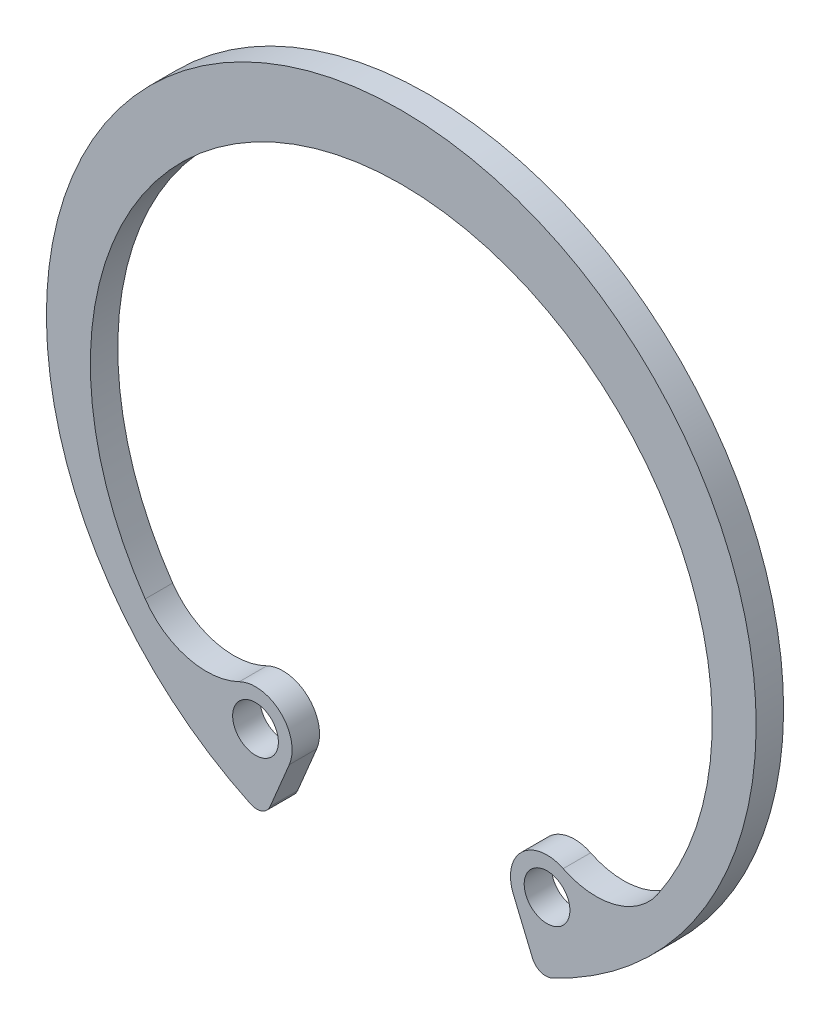
ISO-10303-21;
HEADER;
FILE_DESCRIPTION(('STEP AP214'),'2;1');
FILE_NAME('part.step','',(''),(''),'','','');
FILE_SCHEMA(('AUTOMOTIVE_DESIGN { 1 0 10303 214 1 1 1 1 }'));
ENDSEC;
DATA;
#1=APPLICATION_CONTEXT('core data for automotive mechanical design processes');
#2=APPLICATION_PROTOCOL_DEFINITION('international standard','automotive_design',2000,#1);
#3=PRODUCT_CONTEXT('',#1,'mechanical');
#4=PRODUCT('Part','Part','',(#3));
#5=PRODUCT_RELATED_PRODUCT_CATEGORY('part','',(#4));
#6=PRODUCT_DEFINITION_FORMATION('','',#4);
#7=PRODUCT_DEFINITION_CONTEXT('part definition',#1,'design');
#8=PRODUCT_DEFINITION('design','',#6,#7);
#9=PRODUCT_DEFINITION_SHAPE('','',#8);
#10=(LENGTH_UNIT() NAMED_UNIT(*) SI_UNIT(.MILLI.,.METRE.));
#11=(NAMED_UNIT(*) PLANE_ANGLE_UNIT() SI_UNIT($,.RADIAN.));
#12=(NAMED_UNIT(*) SI_UNIT($,.STERADIAN.) SOLID_ANGLE_UNIT());
#13=UNCERTAINTY_MEASURE_WITH_UNIT(LENGTH_MEASURE(1.E-05),#10,'distance_accuracy_value','');
#14=(GEOMETRIC_REPRESENTATION_CONTEXT(3) GLOBAL_UNCERTAINTY_ASSIGNED_CONTEXT((#13)) GLOBAL_UNIT_ASSIGNED_CONTEXT((#10,
#11,#12)) REPRESENTATION_CONTEXT('',''));
#15=CARTESIAN_POINT('',(0.,0.,0.));
#16=DIRECTION('',(0.,0.,1.));
#17=DIRECTION('',(1.,0.,0.));
#18=AXIS2_PLACEMENT_3D('',#15,#16,#17);
#19=CARTESIAN_POINT('',(0.,0.,-0.749999999999999));
#20=DIRECTION('',(0.,0.,1.));
#21=DIRECTION('',(1.,0.,0.));
#22=AXIS2_PLACEMENT_3D('',#19,#20,#21);
#23=CYLINDRICAL_SURFACE('',#22,19.4);
#24=CARTESIAN_POINT('',(0.,0.,0.750000000000001));
#25=DIRECTION('',(0.,0.,1.));
#26=DIRECTION('',(-1.,0.,0.));
#27=AXIS2_PLACEMENT_3D('',#24,#25,#26);
#28=CIRCLE('',#27,19.4);
#29=CARTESIAN_POINT('',(8.23961465419929,-17.5632784624712,0.750000000000001));
#30=VERTEX_POINT('',#29);
#31=CARTESIAN_POINT('',(-8.23961465419929,-17.5632784624712,0.750000000000001));
#32=VERTEX_POINT('',#31);
#33=EDGE_CURVE('E131',#30,#32,#28,.T.);
#34=ORIENTED_EDGE('',*,*,#33,.F.);
#35=DIRECTION('',(0.,0.,1.));
#36=VECTOR('',#35,1.);
#37=CARTESIAN_POINT('',(8.2396146541993,-17.5632784624712,-0.749999999999999));
#38=LINE('',#37,#36);
#39=CARTESIAN_POINT('',(8.23961465419929,-17.5632784624712,-0.749999999999999));
#40=VERTEX_POINT('',#39);
#41=EDGE_CURVE('E230',#30,#40,#38,.F.);
#42=ORIENTED_EDGE('',*,*,#41,.T.);
#43=CARTESIAN_POINT('',(0.,0.,-0.749999999999999));
#44=DIRECTION('',(0.,0.,1.));
#45=DIRECTION('',(-1.,0.,0.));
#46=AXIS2_PLACEMENT_3D('',#43,#44,#45);
#47=CIRCLE('',#46,19.4);
#48=CARTESIAN_POINT('',(-8.23961465419929,-17.5632784624712,-0.749999999999999));
#49=VERTEX_POINT('',#48);
#50=EDGE_CURVE('E176',#40,#49,#47,.T.);
#51=ORIENTED_EDGE('',*,*,#50,.T.);
#52=DIRECTION('',(0.,0.,1.));
#53=VECTOR('',#52,1.);
#54=CARTESIAN_POINT('',(-8.23961465419929,-17.5632784624712,-0.749999999999999));
#55=LINE('',#54,#53);
#56=EDGE_CURVE('E226',#49,#32,#55,.T.);
#57=ORIENTED_EDGE('',*,*,#56,.T.);
#58=EDGE_LOOP('',(#34,#42,#51,#57));
#59=FACE_BOUND('',#58,.T.);
#60=ADVANCED_FACE('F42',(#59),#23,.T.);
#61=CARTESIAN_POINT('',(6.12302446274948,-14.6461111367001,-0.749999999999999));
#62=DIRECTION('',(-0.922618279569573,-0.385714285714286,0.));
#63=DIRECTION('',(0.385714285714286,-0.922618279569573,0.));
#64=AXIS2_PLACEMENT_3D('',#61,#62,#63);
#65=PLANE('',#64);
#66=DIRECTION('',(0.385714285714286,-0.922618279569573,0.));
#67=VECTOR('',#66,1.);
#68=CARTESIAN_POINT('',(6.12302446274948,-14.6461111367001,-0.749999999999999));
#69=LINE('',#68,#67);
#70=CARTESIAN_POINT('',(6.12302446274948,-14.6461111367001,-0.749999999999999));
#71=VERTEX_POINT('',#70);
#72=CARTESIAN_POINT('',(7.17016298593679,-17.1508385437885,-0.749999999999999));
#73=VERTEX_POINT('',#72);
#74=EDGE_CURVE('E142',#71,#73,#69,.T.);
#75=ORIENTED_EDGE('',*,*,#74,.T.);
#76=DIRECTION('',(0.,0.,1.));
#77=VECTOR('',#76,1.);
#78=CARTESIAN_POINT('',(7.17016298593679,-17.1508385437885,-0.749999999999999));
#79=LINE('',#78,#77);
#80=CARTESIAN_POINT('',(7.17016298593679,-17.1508385437885,0.750000000000001));
#81=VERTEX_POINT('',#80);
#82=EDGE_CURVE('E206',#73,#81,#79,.T.);
#83=ORIENTED_EDGE('',*,*,#82,.T.);
#84=DIRECTION('',(0.385714285714286,-0.922618279569573,0.));
#85=VECTOR('',#84,1.);
#86=CARTESIAN_POINT('',(6.12302446274948,-14.6461111367001,0.750000000000001));
#87=LINE('',#86,#85);
#88=CARTESIAN_POINT('',(6.12302446274948,-14.6461111367001,0.750000000000001));
#89=VERTEX_POINT('',#88);
#90=EDGE_CURVE('E165',#89,#81,#87,.T.);
#91=ORIENTED_EDGE('',*,*,#90,.F.);
#92=DIRECTION('',(0.,0.,1.));
#93=VECTOR('',#92,1.);
#94=CARTESIAN_POINT('',(6.12302446274948,-14.6461111367001,-0.749999999999999));
#95=LINE('',#94,#93);
#96=EDGE_CURVE('E203',#71,#89,#95,.T.);
#97=ORIENTED_EDGE('',*,*,#96,.F.);
#98=EDGE_LOOP('',(#75,#83,#91,#97));
#99=FACE_BOUND('',#98,.T.);
#100=ADVANCED_FACE('F244',(#99),#65,.T.);
#101=CARTESIAN_POINT('',(7.96826102188862,-13.8746825652716,-0.749999999999999));
#102=DIRECTION('',(0.,0.,1.));
#103=DIRECTION('',(1.,0.,0.));
#104=AXIS2_PLACEMENT_3D('',#101,#102,#103);
#105=CYLINDRICAL_SURFACE('',#104,2.);
#106=ORIENTED_EDGE('',*,*,#96,.T.);
#107=CARTESIAN_POINT('',(7.96826102188862,-13.8746825652716,0.750000000000001));
#108=DIRECTION('',(0.,0.,1.));
#109=DIRECTION('',(1.,0.,0.));
#110=AXIS2_PLACEMENT_3D('',#107,#108,#109);
#111=CIRCLE('',#110,2.);
#112=CARTESIAN_POINT('',(8.85144237587703,-12.0802493132482,0.750000000000001));
#113=VERTEX_POINT('',#112);
#114=EDGE_CURVE('E161',#113,#89,#111,.T.);
#115=ORIENTED_EDGE('',*,*,#114,.F.);
#116=DIRECTION('',(0.,0.,1.));
#117=VECTOR('',#116,1.);
#118=CARTESIAN_POINT('',(8.85144237587703,-12.0802493132482,-0.749999999999999));
#119=LINE('',#118,#117);
#120=CARTESIAN_POINT('',(8.85144237587703,-12.0802493132482,-0.749999999999999));
#121=VERTEX_POINT('',#120);
#122=EDGE_CURVE('E207',#121,#113,#119,.T.);
#123=ORIENTED_EDGE('',*,*,#122,.F.);
#124=CARTESIAN_POINT('',(7.96826102188862,-13.8746825652716,-0.749999999999999));
#125=DIRECTION('',(0.,0.,1.));
#126=DIRECTION('',(1.,0.,0.));
#127=AXIS2_PLACEMENT_3D('',#124,#125,#126);
#128=CIRCLE('',#127,2.);
#129=EDGE_CURVE('E196',#121,#71,#128,.T.);
#130=ORIENTED_EDGE('',*,*,#129,.T.);
#131=EDGE_LOOP('',(#106,#115,#123,#130));
#132=FACE_BOUND('',#131,.T.);
#133=ADVANCED_FACE('F279',(#132),#105,.T.);
#134=CARTESIAN_POINT('',(10.6483110380649,-8.4294013165285,-0.749999999999999));
#135=DIRECTION('',(0.,0.,1.));
#136=DIRECTION('',(1.,0.,0.));
#137=AXIS2_PLACEMENT_3D('',#134,#135,#136);
#138=CYLINDRICAL_SURFACE('',#137,4.06908197070359);
#139=ORIENTED_EDGE('',*,*,#122,.T.);
#140=CARTESIAN_POINT('',(10.6483110380649,-8.4294013165285,0.750000000000001));
#141=DIRECTION('',(0.,0.,-1.));
#142=DIRECTION('',(-1.,0.,0.));
#143=AXIS2_PLACEMENT_3D('',#140,#141,#142);
#144=CIRCLE('',#143,4.06908197070359);
#145=CARTESIAN_POINT('',(13.9997580022659,-10.7370475915137,0.750000000000001));
#146=VERTEX_POINT('',#145);
#147=EDGE_CURVE('E157',#146,#113,#144,.T.);
#148=ORIENTED_EDGE('',*,*,#147,.F.);
#149=DIRECTION('',(0.,0.,1.));
#150=VECTOR('',#149,1.);
#151=CARTESIAN_POINT('',(13.9997580022659,-10.7370475915137,-0.749999999999999));
#152=LINE('',#151,#150);
#153=CARTESIAN_POINT('',(13.9997580022659,-10.7370475915137,-0.749999999999999));
#154=VERTEX_POINT('',#153);
#155=EDGE_CURVE('E210',#154,#146,#152,.T.);
#156=ORIENTED_EDGE('',*,*,#155,.F.);
#157=CARTESIAN_POINT('',(10.6483110380649,-8.4294013165285,-0.749999999999999));
#158=DIRECTION('',(0.,0.,-1.));
#159=DIRECTION('',(-1.,0.,0.));
#160=AXIS2_PLACEMENT_3D('',#157,#158,#159);
#161=CIRCLE('',#160,4.06908197070359);
#162=EDGE_CURVE('E192',#154,#121,#161,.T.);
#163=ORIENTED_EDGE('',*,*,#162,.T.);
#164=EDGE_LOOP('',(#139,#148,#156,#163));
#165=FACE_BOUND('',#164,.T.);
#166=ADVANCED_FACE('F293',(#165),#138,.F.);
#167=CARTESIAN_POINT('',(0.,-1.09748302441495,-0.749999999999999));
#168=DIRECTION('',(0.,0.,1.));
#169=DIRECTION('',(1.,0.,0.));
#170=AXIS2_PLACEMENT_3D('',#167,#168,#169);
#171=CYLINDRICAL_SURFACE('',#170,16.9974830244149);
#172=ORIENTED_EDGE('',*,*,#155,.T.);
#173=CARTESIAN_POINT('',(0.,-1.09748302441495,0.750000000000001));
#174=DIRECTION('',(0.,0.,-1.));
#175=DIRECTION('',(-1.,0.,0.));
#176=AXIS2_PLACEMENT_3D('',#173,#174,#175);
#177=CIRCLE('',#176,16.9974830244149);
#178=CARTESIAN_POINT('',(-13.999758002266,-10.7370475915136,0.750000000000001));
#179=VERTEX_POINT('',#178);
#180=EDGE_CURVE('E150',#179,#146,#177,.T.);
#181=ORIENTED_EDGE('',*,*,#180,.F.);
#182=DIRECTION('',(0.,0.,1.));
#183=VECTOR('',#182,1.);
#184=CARTESIAN_POINT('',(-13.999758002266,-10.7370475915136,-0.749999999999999));
#185=LINE('',#184,#183);
#186=CARTESIAN_POINT('',(-13.999758002266,-10.7370475915136,-0.749999999999999));
#187=VERTEX_POINT('',#186);
#188=EDGE_CURVE('E213',#187,#179,#185,.T.);
#189=ORIENTED_EDGE('',*,*,#188,.F.);
#190=CARTESIAN_POINT('',(0.,-1.09748302441495,-0.749999999999999));
#191=DIRECTION('',(0.,0.,-1.));
#192=DIRECTION('',(-1.,0.,0.));
#193=AXIS2_PLACEMENT_3D('',#190,#191,#192);
#194=CIRCLE('',#193,16.9974830244149);
#195=EDGE_CURVE('E188',#187,#154,#194,.T.);
#196=ORIENTED_EDGE('',*,*,#195,.T.);
#197=EDGE_LOOP('',(#172,#181,#189,#196));
#198=FACE_BOUND('',#197,.T.);
#199=ADVANCED_FACE('F289',(#198),#171,.F.);
#200=CARTESIAN_POINT('',(-10.6483110380649,-8.4294013165285,-0.749999999999999));
#201=DIRECTION('',(0.,0.,1.));
#202=DIRECTION('',(1.,0.,0.));
#203=AXIS2_PLACEMENT_3D('',#200,#201,#202);
#204=CYLINDRICAL_SURFACE('',#203,4.06908197070359);
#205=ORIENTED_EDGE('',*,*,#188,.T.);
#206=CARTESIAN_POINT('',(-10.6483110380649,-8.4294013165285,0.750000000000001));
#207=DIRECTION('',(0.,0.,-1.));
#208=DIRECTION('',(1.,0.,0.));
#209=AXIS2_PLACEMENT_3D('',#206,#207,#208);
#210=CIRCLE('',#209,4.06908197070359);
#211=CARTESIAN_POINT('',(-8.85144237587703,-12.0802493132482,0.750000000000001));
#212=VERTEX_POINT('',#211);
#213=EDGE_CURVE('E146',#212,#179,#210,.T.);
#214=ORIENTED_EDGE('',*,*,#213,.F.);
#215=DIRECTION('',(0.,0.,1.));
#216=VECTOR('',#215,1.);
#217=CARTESIAN_POINT('',(-8.85144237587703,-12.0802493132482,-0.749999999999999));
#218=LINE('',#217,#216);
#219=CARTESIAN_POINT('',(-8.85144237587703,-12.0802493132482,-0.749999999999999));
#220=VERTEX_POINT('',#219);
#221=EDGE_CURVE('E141',#220,#212,#218,.T.);
#222=ORIENTED_EDGE('',*,*,#221,.F.);
#223=CARTESIAN_POINT('',(-10.6483110380649,-8.4294013165285,-0.749999999999999));
#224=DIRECTION('',(0.,0.,-1.));
#225=DIRECTION('',(1.,0.,0.));
#226=AXIS2_PLACEMENT_3D('',#223,#224,#225);
#227=CIRCLE('',#226,4.06908197070359);
#228=EDGE_CURVE('E184',#220,#187,#227,.T.);
#229=ORIENTED_EDGE('',*,*,#228,.T.);
#230=EDGE_LOOP('',(#205,#214,#222,#229));
#231=FACE_BOUND('',#230,.T.);
#232=ADVANCED_FACE('F286',(#231),#204,.F.);
#233=CARTESIAN_POINT('',(-7.96826102188862,-13.8746825652716,-0.749999999999999));
#234=DIRECTION('',(0.,0.,1.));
#235=DIRECTION('',(1.,0.,0.));
#236=AXIS2_PLACEMENT_3D('',#233,#234,#235);
#237=CYLINDRICAL_SURFACE('',#236,2.);
#238=ORIENTED_EDGE('',*,*,#221,.T.);
#239=CARTESIAN_POINT('',(-7.96826102188862,-13.8746825652716,0.750000000000001));
#240=DIRECTION('',(0.,0.,1.));
#241=DIRECTION('',(-1.,0.,0.));
#242=AXIS2_PLACEMENT_3D('',#239,#240,#241);
#243=CIRCLE('',#242,2.);
#244=CARTESIAN_POINT('',(-6.12302446274948,-14.6461111367001,0.750000000000001));
#245=VERTEX_POINT('',#244);
#246=EDGE_CURVE('E126',#245,#212,#243,.T.);
#247=ORIENTED_EDGE('',*,*,#246,.F.);
#248=DIRECTION('',(0.,0.,1.));
#249=VECTOR('',#248,1.);
#250=CARTESIAN_POINT('',(-6.12302446274948,-14.6461111367001,-0.749999999999999));
#251=LINE('',#250,#249);
#252=CARTESIAN_POINT('',(-6.12302446274948,-14.6461111367001,-0.749999999999999));
#253=VERTEX_POINT('',#252);
#254=EDGE_CURVE('E134',#253,#245,#251,.T.);
#255=ORIENTED_EDGE('',*,*,#254,.F.);
#256=CARTESIAN_POINT('',(-7.96826102188862,-13.8746825652716,-0.749999999999999));
#257=DIRECTION('',(0.,0.,1.));
#258=DIRECTION('',(-1.,0.,0.));
#259=AXIS2_PLACEMENT_3D('',#256,#257,#258);
#260=CIRCLE('',#259,2.);
#261=EDGE_CURVE('E181',#253,#220,#260,.T.);
#262=ORIENTED_EDGE('',*,*,#261,.T.);
#263=EDGE_LOOP('',(#238,#247,#255,#262));
#264=FACE_BOUND('',#263,.T.);
#265=ADVANCED_FACE('F144',(#264),#237,.T.);
#266=CARTESIAN_POINT('',(-6.12302446274948,-14.6461111367001,-0.749999999999999));
#267=DIRECTION('',(0.922618279569573,-0.385714285714286,0.));
#268=DIRECTION('',(0.385714285714286,0.922618279569573,0.));
#269=AXIS2_PLACEMENT_3D('',#266,#267,#268);
#270=PLANE('',#269);
#271=DIRECTION('',(0.385714285714286,0.922618279569573,0.));
#272=VECTOR('',#271,1.);
#273=CARTESIAN_POINT('',(-6.12302446274948,-14.6461111367001,0.750000000000001));
#274=LINE('',#273,#272);
#275=CARTESIAN_POINT('',(-7.17016298593679,-17.1508385437885,0.750000000000001));
#276=VERTEX_POINT('',#275);
#277=EDGE_CURVE('E119',#276,#245,#274,.T.);
#278=ORIENTED_EDGE('',*,*,#277,.F.);
#279=DIRECTION('',(0.,0.,1.));
#280=VECTOR('',#279,1.);
#281=CARTESIAN_POINT('',(-7.17016298593679,-17.1508385437885,-0.749999999999999));
#282=LINE('',#281,#280);
#283=CARTESIAN_POINT('',(-7.17016298593679,-17.1508385437885,-0.749999999999999));
#284=VERTEX_POINT('',#283);
#285=EDGE_CURVE('E11',#276,#284,#282,.F.);
#286=ORIENTED_EDGE('',*,*,#285,.T.);
#287=DIRECTION('',(0.385714285714286,0.922618279569573,0.));
#288=VECTOR('',#287,1.);
#289=CARTESIAN_POINT('',(-6.12302446274948,-14.6461111367001,-0.749999999999999));
#290=LINE('',#289,#288);
#291=EDGE_CURVE('E136',#284,#253,#290,.T.);
#292=ORIENTED_EDGE('',*,*,#291,.T.);
#293=ORIENTED_EDGE('',*,*,#254,.T.);
#294=EDGE_LOOP('',(#278,#286,#292,#293));
#295=FACE_BOUND('',#294,.T.);
#296=ADVANCED_FACE('F135',(#295),#270,.T.);
#297=CARTESIAN_POINT('',(0.,0.,-0.749999999999999));
#298=DIRECTION('',(0.,0.,-1.));
#299=DIRECTION('',(-1.,0.,0.));
#300=AXIS2_PLACEMENT_3D('',#297,#298,#299);
#301=PLANE('',#300);
#302=CARTESIAN_POINT('',(7.96826102188862,-13.8746825652716,-0.749999999999999));
#303=DIRECTION('',(0.,0.,1.));
#304=DIRECTION('',(-1.,0.,0.));
#305=AXIS2_PLACEMENT_3D('',#302,#303,#304);
#306=CIRCLE('',#305,1.25);
#307=CARTESIAN_POINT('',(6.71826102188862,-13.8746825652716,-0.749999999999999));
#308=VERTEX_POINT('',#307);
#309=EDGE_CURVE('E168',#308,#308,#306,.T.);
#310=ORIENTED_EDGE('',*,*,#309,.T.);
#311=EDGE_LOOP('',(#310));
#312=FACE_BOUND('',#311,.T.);
#313=CARTESIAN_POINT('',(-7.96826102188862,-13.8746825652716,-0.749999999999999));
#314=DIRECTION('',(0.,0.,1.));
#315=DIRECTION('',(1.,0.,0.));
#316=AXIS2_PLACEMENT_3D('',#313,#314,#315);
#317=CIRCLE('',#316,1.25);
#318=CARTESIAN_POINT('',(-6.71826102188862,-13.8746825652716,-0.749999999999999));
#319=VERTEX_POINT('',#318);
#320=EDGE_CURVE('E172',#319,#319,#317,.T.);
#321=ORIENTED_EDGE('',*,*,#320,.T.);
#322=EDGE_LOOP('',(#321));
#323=FACE_BOUND('',#322,.T.);
#324=ORIENTED_EDGE('',*,*,#50,.F.);
#325=CARTESIAN_POINT('',(7.90249124534513,-16.8446778295028,-0.749999999999999));
#326=DIRECTION('',(0.,0.,-1.));
#327=DIRECTION('',(-1.,0.,0.));
#328=AXIS2_PLACEMENT_3D('',#325,#326,#327);
#329=CIRCLE('',#328,0.79375);
#330=EDGE_CURVE('E51',#40,#73,#329,.T.);
#331=ORIENTED_EDGE('',*,*,#330,.T.);
#332=ORIENTED_EDGE('',*,*,#74,.F.);
#333=ORIENTED_EDGE('',*,*,#129,.F.);
#334=ORIENTED_EDGE('',*,*,#162,.F.);
#335=ORIENTED_EDGE('',*,*,#195,.F.);
#336=ORIENTED_EDGE('',*,*,#228,.F.);
#337=ORIENTED_EDGE('',*,*,#261,.F.);
#338=ORIENTED_EDGE('',*,*,#291,.F.);
#339=CARTESIAN_POINT('',(-7.90249124534513,-16.8446778295028,-0.749999999999999));
#340=DIRECTION('',(0.,0.,-1.));
#341=DIRECTION('',(-1.,0.,0.));
#342=AXIS2_PLACEMENT_3D('',#339,#340,#341);
#343=CIRCLE('',#342,0.79375);
#344=EDGE_CURVE('E63',#284,#49,#343,.T.);
#345=ORIENTED_EDGE('',*,*,#344,.T.);
#346=EDGE_LOOP('',(#324,#331,#332,#333,#334,#335,#336,#337,#338,#345));
#347=FACE_BOUND('',#346,.T.);
#348=ADVANCED_FACE('F238',(#312,#323,#347),#301,.T.);
#349=CARTESIAN_POINT('',(-7.96826102188862,-13.8746825652716,-0.749999999999999));
#350=DIRECTION('',(0.,0.,1.));
#351=DIRECTION('',(1.,0.,0.));
#352=AXIS2_PLACEMENT_3D('',#349,#350,#351);
#353=CYLINDRICAL_SURFACE('',#352,1.25);
#354=ORIENTED_EDGE('',*,*,#320,.F.);
#355=EDGE_LOOP('',(#354));
#356=FACE_BOUND('',#355,.T.);
#357=CARTESIAN_POINT('',(-7.96826102188862,-13.8746825652716,0.750000000000001));
#358=DIRECTION('',(0.,0.,1.));
#359=DIRECTION('',(1.,0.,0.));
#360=AXIS2_PLACEMENT_3D('',#357,#358,#359);
#361=CIRCLE('',#360,1.25);
#362=CARTESIAN_POINT('',(-6.71826102188862,-13.8746825652716,0.750000000000001));
#363=VERTEX_POINT('',#362);
#364=EDGE_CURVE('E251',#363,#363,#361,.T.);
#365=ORIENTED_EDGE('',*,*,#364,.T.);
#366=EDGE_LOOP('',(#365));
#367=FACE_BOUND('',#366,.T.);
#368=ADVANCED_FACE('F271',(#356,#367),#353,.F.);
#369=CARTESIAN_POINT('',(7.96826102188862,-13.8746825652716,-0.749999999999999));
#370=DIRECTION('',(0.,0.,1.));
#371=DIRECTION('',(1.,0.,0.));
#372=AXIS2_PLACEMENT_3D('',#369,#370,#371);
#373=CYLINDRICAL_SURFACE('',#372,1.25);
#374=ORIENTED_EDGE('',*,*,#309,.F.);
#375=EDGE_LOOP('',(#374));
#376=FACE_BOUND('',#375,.T.);
#377=CARTESIAN_POINT('',(7.96826102188862,-13.8746825652716,0.750000000000001));
#378=DIRECTION('',(0.,0.,1.));
#379=DIRECTION('',(-1.,0.,0.));
#380=AXIS2_PLACEMENT_3D('',#377,#378,#379);
#381=CIRCLE('',#380,1.25);
#382=CARTESIAN_POINT('',(6.71826102188862,-13.8746825652716,0.750000000000001));
#383=VERTEX_POINT('',#382);
#384=EDGE_CURVE('E255',#383,#383,#381,.T.);
#385=ORIENTED_EDGE('',*,*,#384,.T.);
#386=EDGE_LOOP('',(#385));
#387=FACE_BOUND('',#386,.T.);
#388=ADVANCED_FACE('F263',(#376,#387),#373,.F.);
#389=CARTESIAN_POINT('',(0.,0.,0.750000000000001));
#390=DIRECTION('',(0.,0.,-1.));
#391=DIRECTION('',(-1.,0.,0.));
#392=AXIS2_PLACEMENT_3D('',#389,#390,#391);
#393=PLANE('',#392);
#394=ORIENTED_EDGE('',*,*,#90,.T.);
#395=CARTESIAN_POINT('',(7.90249124534513,-16.8446778295028,0.750000000000001));
#396=DIRECTION('',(0.,0.,-1.));
#397=DIRECTION('',(-1.,0.,0.));
#398=AXIS2_PLACEMENT_3D('',#395,#396,#397);
#399=CIRCLE('',#398,0.79375);
#400=EDGE_CURVE('E223',#81,#30,#399,.F.);
#401=ORIENTED_EDGE('',*,*,#400,.T.);
#402=ORIENTED_EDGE('',*,*,#33,.T.);
#403=CARTESIAN_POINT('',(-7.90249124534513,-16.8446778295028,0.750000000000001));
#404=DIRECTION('',(0.,0.,-1.));
#405=DIRECTION('',(-1.,0.,0.));
#406=AXIS2_PLACEMENT_3D('',#403,#404,#405);
#407=CIRCLE('',#406,0.79375);
#408=EDGE_CURVE('E129',#32,#276,#407,.F.);
#409=ORIENTED_EDGE('',*,*,#408,.T.);
#410=ORIENTED_EDGE('',*,*,#277,.T.);
#411=ORIENTED_EDGE('',*,*,#246,.T.);
#412=ORIENTED_EDGE('',*,*,#213,.T.);
#413=ORIENTED_EDGE('',*,*,#180,.T.);
#414=ORIENTED_EDGE('',*,*,#147,.T.);
#415=ORIENTED_EDGE('',*,*,#114,.T.);
#416=EDGE_LOOP('',(#394,#401,#402,#409,#410,#411,#412,#413,#414,#415));
#417=FACE_BOUND('',#416,.T.);
#418=ORIENTED_EDGE('',*,*,#364,.F.);
#419=EDGE_LOOP('',(#418));
#420=FACE_BOUND('',#419,.T.);
#421=ORIENTED_EDGE('',*,*,#384,.F.);
#422=EDGE_LOOP('',(#421));
#423=FACE_BOUND('',#422,.T.);
#424=ADVANCED_FACE('F122',(#417,#420,#423),#393,.F.);
#425=CARTESIAN_POINT('',(7.90249124534513,-16.8446778295028,-0.749999999999999));
#426=DIRECTION('',(0.,0.,1.));
#427=DIRECTION('',(1.,0.,0.));
#428=AXIS2_PLACEMENT_3D('',#425,#426,#427);
#429=CYLINDRICAL_SURFACE('',#428,0.79375);
#430=ORIENTED_EDGE('',*,*,#330,.F.);
#431=ORIENTED_EDGE('',*,*,#41,.F.);
#432=ORIENTED_EDGE('',*,*,#400,.F.);
#433=ORIENTED_EDGE('',*,*,#82,.F.);
#434=EDGE_LOOP('',(#430,#431,#432,#433));
#435=FACE_BOUND('',#434,.T.);
#436=ADVANCED_FACE('F246',(#435),#429,.T.);
#437=CARTESIAN_POINT('',(-7.90249124534513,-16.8446778295028,-0.749999999999999));
#438=DIRECTION('',(0.,0.,1.));
#439=DIRECTION('',(1.,0.,0.));
#440=AXIS2_PLACEMENT_3D('',#437,#438,#439);
#441=CYLINDRICAL_SURFACE('',#440,0.79375);
#442=ORIENTED_EDGE('',*,*,#344,.F.);
#443=ORIENTED_EDGE('',*,*,#285,.F.);
#444=ORIENTED_EDGE('',*,*,#408,.F.);
#445=ORIENTED_EDGE('',*,*,#56,.F.);
#446=EDGE_LOOP('',(#442,#443,#444,#445));
#447=FACE_BOUND('',#446,.T.);
#448=ADVANCED_FACE('F44',(#447),#441,.T.);
#449=CLOSED_SHELL('',(#60,#100,#133,#166,#199,#232,#265,#296,#348,#368,#388,#424,#436,#448));
#450=MANIFOLD_SOLID_BREP('B2',#449);
#451=ADVANCED_BREP_SHAPE_REPRESENTATION('',(#18,#450),#14);
#452=SHAPE_DEFINITION_REPRESENTATION(#9,#451);
ENDSEC;
END-ISO-10303-21;
